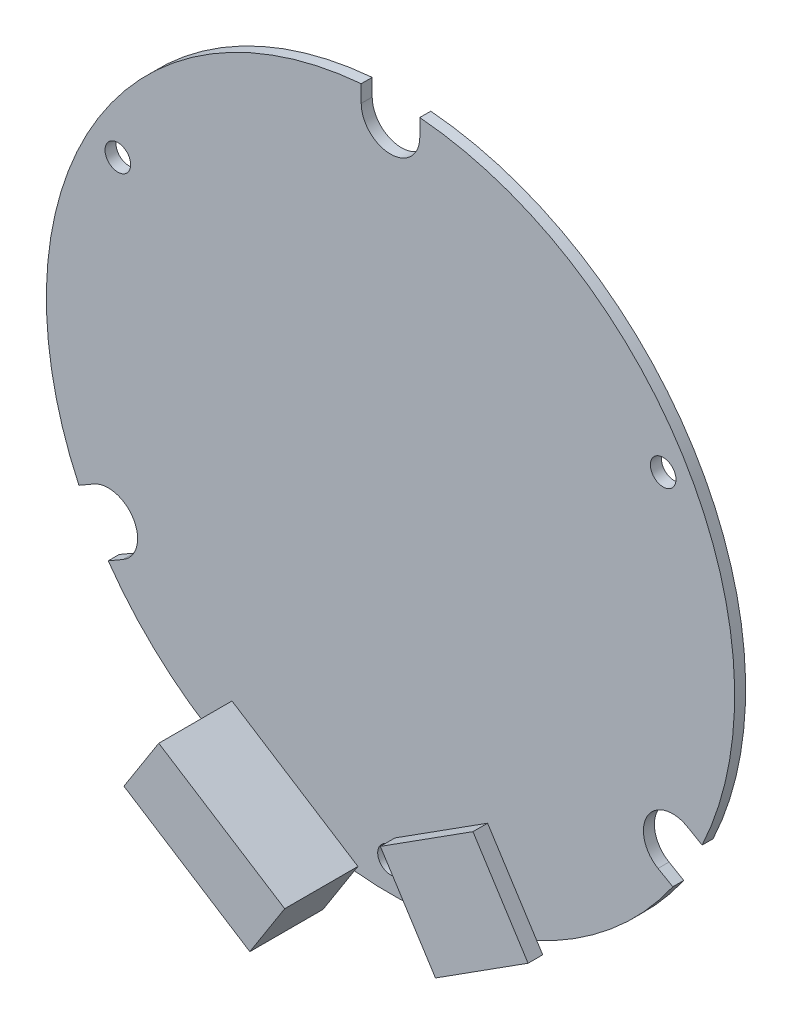
ISO-10303-21;
HEADER;
FILE_DESCRIPTION(('STEP AP214'),'2;1');
FILE_NAME('part.step','',(''),(''),'','','');
FILE_SCHEMA(('AUTOMOTIVE_DESIGN { 1 0 10303 214 1 1 1 1 }'));
ENDSEC;
DATA;
#1=APPLICATION_CONTEXT('core data for automotive mechanical design processes');
#2=APPLICATION_PROTOCOL_DEFINITION('international standard','automotive_design',2000,#1);
#3=PRODUCT_CONTEXT('',#1,'mechanical');
#4=PRODUCT('Part','Part','',(#3));
#5=PRODUCT_RELATED_PRODUCT_CATEGORY('part','',(#4));
#6=PRODUCT_DEFINITION_FORMATION('','',#4);
#7=PRODUCT_DEFINITION_CONTEXT('part definition',#1,'design');
#8=PRODUCT_DEFINITION('design','',#6,#7);
#9=PRODUCT_DEFINITION_SHAPE('','',#8);
#10=(LENGTH_UNIT() NAMED_UNIT(*) SI_UNIT(.MILLI.,.METRE.));
#11=(NAMED_UNIT(*) PLANE_ANGLE_UNIT() SI_UNIT($,.RADIAN.));
#12=(NAMED_UNIT(*) SI_UNIT($,.STERADIAN.) SOLID_ANGLE_UNIT());
#13=UNCERTAINTY_MEASURE_WITH_UNIT(LENGTH_MEASURE(1.E-05),#10,'distance_accuracy_value','');
#14=(GEOMETRIC_REPRESENTATION_CONTEXT(3) GLOBAL_UNCERTAINTY_ASSIGNED_CONTEXT((#13)) GLOBAL_UNIT_ASSIGNED_CONTEXT((#10,
#11,#12)) REPRESENTATION_CONTEXT('',''));
#15=CARTESIAN_POINT('',(0.,0.,0.));
#16=DIRECTION('',(0.,0.,1.));
#17=DIRECTION('',(1.,0.,0.));
#18=AXIS2_PLACEMENT_3D('',#15,#16,#17);
#19=CARTESIAN_POINT('',(15.259137072166,-30.0051714938875,5.5));
#20=DIRECTION('',(0.537741133403152,-0.843110000798409,0.));
#21=DIRECTION('',(0.843110000798409,0.537741133403152,0.));
#22=AXIS2_PLACEMENT_3D('',#19,#20,#21);
#23=PLANE('',#22);
#24=DIRECTION('',(-0.843110000798409,-0.537741133403152,0.));
#25=VECTOR('',#24,1.);
#26=CARTESIAN_POINT('',(15.259137072166,-30.0051714938875,3.5));
#27=LINE('',#26,#25);
#28=CARTESIAN_POINT('',(15.259137072166,-30.0051714938875,3.5));
#29=VERTEX_POINT('',#28);
#30=CARTESIAN_POINT('',(2.61248706018986,-38.0712884949348,3.5));
#31=VERTEX_POINT('',#30);
#32=EDGE_CURVE('E117',#29,#31,#27,.T.);
#33=ORIENTED_EDGE('',*,*,#32,.T.);
#34=DIRECTION('',(0.,0.,-1.));
#35=VECTOR('',#34,1.);
#36=CARTESIAN_POINT('',(2.61248706018986,-38.0712884949348,5.5));
#37=LINE('',#36,#35);
#38=CARTESIAN_POINT('',(2.61248706018986,-38.0712884949348,5.5));
#39=VERTEX_POINT('',#38);
#40=EDGE_CURVE('E12',#39,#31,#37,.T.);
#41=ORIENTED_EDGE('',*,*,#40,.F.);
#42=DIRECTION('',(-0.843110000798409,-0.537741133403152,0.));
#43=VECTOR('',#42,1.);
#44=CARTESIAN_POINT('',(15.259137072166,-30.0051714938875,5.5));
#45=LINE('',#44,#43);
#46=CARTESIAN_POINT('',(15.259137072166,-30.0051714938875,5.5));
#47=VERTEX_POINT('',#46);
#48=EDGE_CURVE('E105',#47,#39,#45,.T.);
#49=ORIENTED_EDGE('',*,*,#48,.F.);
#50=DIRECTION('',(0.,0.,-1.));
#51=VECTOR('',#50,1.);
#52=CARTESIAN_POINT('',(15.259137072166,-30.0051714938875,5.5));
#53=LINE('',#52,#51);
#54=EDGE_CURVE('E113',#47,#29,#53,.T.);
#55=ORIENTED_EDGE('',*,*,#54,.T.);
#56=EDGE_LOOP('',(#33,#41,#49,#55));
#57=FACE_BOUND('',#56,.T.);
#58=ADVANCED_FACE('F54',(#57),#23,.F.);
#59=CARTESIAN_POINT('',(2.61248706018986,-38.0712884949348,5.5));
#60=DIRECTION('',(0.84311000079841,0.537741133403152,0.));
#61=DIRECTION('',(-0.537741133403152,0.84311000079841,0.));
#62=AXIS2_PLACEMENT_3D('',#59,#60,#61);
#63=PLANE('',#62);
#64=DIRECTION('',(0.537741133403151,-0.843110000798409,0.));
#65=VECTOR('',#64,1.);
#66=CARTESIAN_POINT('',(2.61248706018986,-38.0712884949348,3.5));
#67=LINE('',#66,#65);
#68=CARTESIAN_POINT('',(10.140862927834,-49.8748285061125,3.5));
#69=VERTEX_POINT('',#68);
#70=EDGE_CURVE('E109',#31,#69,#67,.T.);
#71=ORIENTED_EDGE('',*,*,#70,.T.);
#72=DIRECTION('',(0.,0.,-1.));
#73=VECTOR('',#72,1.);
#74=CARTESIAN_POINT('',(10.140862927834,-49.8748285061125,5.5));
#75=LINE('',#74,#73);
#76=CARTESIAN_POINT('',(10.140862927834,-49.8748285061125,5.5));
#77=VERTEX_POINT('',#76);
#78=EDGE_CURVE('E62',#77,#69,#75,.T.);
#79=ORIENTED_EDGE('',*,*,#78,.F.);
#80=DIRECTION('',(0.537741133403151,-0.843110000798409,0.));
#81=VECTOR('',#80,1.);
#82=CARTESIAN_POINT('',(2.61248706018986,-38.0712884949348,5.5));
#83=LINE('',#82,#81);
#84=EDGE_CURVE('E100',#39,#77,#83,.T.);
#85=ORIENTED_EDGE('',*,*,#84,.F.);
#86=ORIENTED_EDGE('',*,*,#40,.T.);
#87=EDGE_LOOP('',(#71,#79,#85,#86));
#88=FACE_BOUND('',#87,.T.);
#89=ADVANCED_FACE('F108',(#88),#63,.F.);
#90=CARTESIAN_POINT('',(22.7875129398101,-41.8087115050652,5.5));
#91=DIRECTION('',(-0.537741133403152,0.843110000798409,0.));
#92=DIRECTION('',(-0.843110000798409,-0.537741133403152,0.));
#93=AXIS2_PLACEMENT_3D('',#90,#91,#92);
#94=PLANE('',#93);
#95=DIRECTION('',(0.843110000798409,0.537741133403152,0.));
#96=VECTOR('',#95,1.);
#97=CARTESIAN_POINT('',(22.7875129398101,-41.8087115050652,3.5));
#98=LINE('',#97,#96);
#99=CARTESIAN_POINT('',(22.7875129398101,-41.8087115050652,3.5));
#100=VERTEX_POINT('',#99);
#101=EDGE_CURVE('E87',#69,#100,#98,.T.);
#102=ORIENTED_EDGE('',*,*,#101,.T.);
#103=DIRECTION('',(0.,0.,-1.));
#104=VECTOR('',#103,1.);
#105=CARTESIAN_POINT('',(22.7875129398101,-41.8087115050652,5.5));
#106=LINE('',#105,#104);
#107=CARTESIAN_POINT('',(22.7875129398101,-41.8087115050652,5.5));
#108=VERTEX_POINT('',#107);
#109=EDGE_CURVE('E110',#108,#100,#106,.T.);
#110=ORIENTED_EDGE('',*,*,#109,.F.);
#111=DIRECTION('',(0.843110000798409,0.537741133403152,0.));
#112=VECTOR('',#111,1.);
#113=CARTESIAN_POINT('',(22.7875129398101,-41.8087115050652,5.5));
#114=LINE('',#113,#112);
#115=EDGE_CURVE('E103',#77,#108,#114,.T.);
#116=ORIENTED_EDGE('',*,*,#115,.F.);
#117=ORIENTED_EDGE('',*,*,#78,.T.);
#118=EDGE_LOOP('',(#102,#110,#116,#117));
#119=FACE_BOUND('',#118,.T.);
#120=ADVANCED_FACE('F111',(#119),#94,.F.);
#121=CARTESIAN_POINT('',(15.259137072166,-30.0051714938875,5.5));
#122=DIRECTION('',(-0.843110000798409,-0.537741133403152,0.));
#123=DIRECTION('',(0.537741133403152,-0.843110000798409,0.));
#124=AXIS2_PLACEMENT_3D('',#121,#122,#123);
#125=PLANE('',#124);
#126=DIRECTION('',(-0.537741133403152,0.843110000798409,0.));
#127=VECTOR('',#126,1.);
#128=CARTESIAN_POINT('',(15.259137072166,-30.0051714938875,3.5));
#129=LINE('',#128,#127);
#130=EDGE_CURVE('E93',#100,#29,#129,.T.);
#131=ORIENTED_EDGE('',*,*,#130,.T.);
#132=ORIENTED_EDGE('',*,*,#54,.F.);
#133=DIRECTION('',(-0.537741133403152,0.843110000798409,0.));
#134=VECTOR('',#133,1.);
#135=CARTESIAN_POINT('',(15.259137072166,-30.0051714938875,5.5));
#136=LINE('',#135,#134);
#137=EDGE_CURVE('E70',#108,#47,#136,.T.);
#138=ORIENTED_EDGE('',*,*,#137,.F.);
#139=ORIENTED_EDGE('',*,*,#109,.T.);
#140=EDGE_LOOP('',(#131,#132,#138,#139));
#141=FACE_BOUND('',#140,.T.);
#142=ADVANCED_FACE('F124',(#141),#125,.F.);
#143=CARTESIAN_POINT('',(0.,0.,5.5));
#144=DIRECTION('',(0.,0.,1.));
#145=DIRECTION('',(1.,0.,0.));
#146=AXIS2_PLACEMENT_3D('',#143,#144,#145);
#147=PLANE('',#146);
#148=ORIENTED_EDGE('',*,*,#48,.T.);
#149=ORIENTED_EDGE('',*,*,#84,.T.);
#150=ORIENTED_EDGE('',*,*,#115,.T.);
#151=ORIENTED_EDGE('',*,*,#137,.T.);
#152=EDGE_LOOP('',(#148,#149,#150,#151));
#153=FACE_BOUND('',#152,.T.);
#154=ADVANCED_FACE('F101',(#153),#147,.T.);
#155=CARTESIAN_POINT('',(0.,0.,3.5));
#156=DIRECTION('',(0.,0.,1.));
#157=DIRECTION('',(1.,0.,0.));
#158=AXIS2_PLACEMENT_3D('',#155,#156,#157);
#159=PLANE('',#158);
#160=ORIENTED_EDGE('',*,*,#32,.F.);
#161=ORIENTED_EDGE('',*,*,#130,.F.);
#162=ORIENTED_EDGE('',*,*,#101,.F.);
#163=ORIENTED_EDGE('',*,*,#70,.F.);
#164=EDGE_LOOP('',(#160,#161,#162,#163));
#165=FACE_BOUND('',#164,.T.);
#166=ADVANCED_FACE('F127',(#165),#159,.F.);
#167=CLOSED_SHELL('',(#58,#89,#120,#142,#154,#166));
#168=MANIFOLD_SOLID_BREP('B2',#167);
#169=CARTESIAN_POINT('',(0.,44.5,1.5));
#170=DIRECTION('',(0.,0.,-1.));
#171=DIRECTION('',(-1.,0.,0.));
#172=AXIS2_PLACEMENT_3D('',#169,#170,#171);
#173=CYLINDRICAL_SURFACE('',#172,4.);
#174=CARTESIAN_POINT('',(0.,44.5,0.));
#175=DIRECTION('',(0.,0.,1.));
#176=DIRECTION('',(1.,0.,0.));
#177=AXIS2_PLACEMENT_3D('',#174,#175,#176);
#178=CIRCLE('',#177,4.);
#179=CARTESIAN_POINT('',(-4.,44.5,0.));
#180=VERTEX_POINT('',#179);
#181=CARTESIAN_POINT('',(4.,44.5,0.));
#182=VERTEX_POINT('',#181);
#183=EDGE_CURVE('E342',#180,#182,#178,.T.);
#184=ORIENTED_EDGE('',*,*,#183,.F.);
#185=DIRECTION('',(0.,0.,-1.));
#186=VECTOR('',#185,1.);
#187=CARTESIAN_POINT('',(-4.,44.5,1.5));
#188=LINE('',#187,#186);
#189=CARTESIAN_POINT('',(-4.,44.5,1.5));
#190=VERTEX_POINT('',#189);
#191=EDGE_CURVE('E183',#190,#180,#188,.T.);
#192=ORIENTED_EDGE('',*,*,#191,.F.);
#193=CARTESIAN_POINT('',(0.,44.5,1.5));
#194=DIRECTION('',(0.,0.,1.));
#195=DIRECTION('',(1.,0.,0.));
#196=AXIS2_PLACEMENT_3D('',#193,#194,#195);
#197=CIRCLE('',#196,4.);
#198=CARTESIAN_POINT('',(4.,44.5,1.5));
#199=VERTEX_POINT('',#198);
#200=EDGE_CURVE('E363',#190,#199,#197,.T.);
#201=ORIENTED_EDGE('',*,*,#200,.T.);
#202=DIRECTION('',(0.,0.,-1.));
#203=VECTOR('',#202,1.);
#204=CARTESIAN_POINT('',(4.,44.5,1.5));
#205=LINE('',#204,#203);
#206=EDGE_CURVE('E425',#199,#182,#205,.T.);
#207=ORIENTED_EDGE('',*,*,#206,.T.);
#208=EDGE_LOOP('',(#184,#192,#201,#207));
#209=FACE_BOUND('',#208,.T.);
#210=ADVANCED_FACE('F180',(#209),#173,.F.);
#211=CARTESIAN_POINT('',(-4.,0.,1.5));
#212=DIRECTION('',(-1.,0.,0.));
#213=DIRECTION('',(0.,0.,1.));
#214=AXIS2_PLACEMENT_3D('',#211,#212,#213);
#215=PLANE('',#214);
#216=DIRECTION('',(0.,1.,0.));
#217=VECTOR('',#216,1.);
#218=CARTESIAN_POINT('',(-4.,0.,0.));
#219=LINE('',#218,#217);
#220=CARTESIAN_POINT('',(-4.,46.8294778958724,0.));
#221=VERTEX_POINT('',#220);
#222=EDGE_CURVE('E429',#180,#221,#219,.T.);
#223=ORIENTED_EDGE('',*,*,#222,.T.);
#224=DIRECTION('',(0.,0.,-1.));
#225=VECTOR('',#224,1.);
#226=CARTESIAN_POINT('',(-4.,46.8294778958724,1.5));
#227=LINE('',#226,#225);
#228=CARTESIAN_POINT('',(-4.,46.8294778958724,1.5));
#229=VERTEX_POINT('',#228);
#230=EDGE_CURVE('E499',#229,#221,#227,.T.);
#231=ORIENTED_EDGE('',*,*,#230,.F.);
#232=DIRECTION('',(0.,1.,0.));
#233=VECTOR('',#232,1.);
#234=CARTESIAN_POINT('',(-4.,0.,1.5));
#235=LINE('',#234,#233);
#236=EDGE_CURVE('E368',#190,#229,#235,.T.);
#237=ORIENTED_EDGE('',*,*,#236,.F.);
#238=ORIENTED_EDGE('',*,*,#191,.T.);
#239=EDGE_LOOP('',(#223,#231,#237,#238));
#240=FACE_BOUND('',#239,.T.);
#241=ADVANCED_FACE('F510',(#240),#215,.F.);
#242=CARTESIAN_POINT('',(0.,0.,1.5));
#243=DIRECTION('',(0.,0.,-1.));
#244=DIRECTION('',(-1.,0.,0.));
#245=AXIS2_PLACEMENT_3D('',#242,#243,#244);
#246=CYLINDRICAL_SURFACE('',#245,47.);
#247=CARTESIAN_POINT('',(0.,0.,0.));
#248=DIRECTION('',(0.,0.,1.));
#249=DIRECTION('',(1.,0.,0.));
#250=AXIS2_PLACEMENT_3D('',#247,#248,#249);
#251=CIRCLE('',#250,47.);
#252=CARTESIAN_POINT('',(-42.5555175037918,-19.950637332789,0.));
#253=VERTEX_POINT('',#252);
#254=EDGE_CURVE('E432',#221,#253,#251,.T.);
#255=ORIENTED_EDGE('',*,*,#254,.T.);
#256=DIRECTION('',(0.,0.,-1.));
#257=VECTOR('',#256,1.);
#258=CARTESIAN_POINT('',(-42.5555175037918,-19.950637332789,1.5));
#259=LINE('',#258,#257);
#260=CARTESIAN_POINT('',(-42.5555175037918,-19.950637332789,1.5));
#261=VERTEX_POINT('',#260);
#262=EDGE_CURVE('E497',#261,#253,#259,.T.);
#263=ORIENTED_EDGE('',*,*,#262,.F.);
#264=CARTESIAN_POINT('',(0.,0.,1.5));
#265=DIRECTION('',(0.,0.,1.));
#266=DIRECTION('',(1.,0.,0.));
#267=AXIS2_PLACEMENT_3D('',#264,#265,#266);
#268=CIRCLE('',#267,47.);
#269=EDGE_CURVE('E377',#229,#261,#268,.T.);
#270=ORIENTED_EDGE('',*,*,#269,.F.);
#271=ORIENTED_EDGE('',*,*,#230,.T.);
#272=EDGE_LOOP('',(#255,#263,#270,#271));
#273=FACE_BOUND('',#272,.T.);
#274=ADVANCED_FACE('F557',(#273),#246,.T.);
#275=CARTESIAN_POINT('',(-1.99999999999923,3.4641016151382,1.5));
#276=DIRECTION('',(0.499999999999807,-0.86602540378455,0.));
#277=DIRECTION('',(0.86602540378455,0.499999999999807,0.));
#278=AXIS2_PLACEMENT_3D('',#275,#276,#277);
#279=PLANE('',#278);
#280=DIRECTION('',(-0.86602540378455,-0.499999999999807,0.));
#281=VECTOR('',#280,1.);
#282=CARTESIAN_POINT('',(-1.99999999999923,3.4641016151382,0.));
#283=LINE('',#282,#281);
#284=CARTESIAN_POINT('',(-40.5381304684117,-18.7858983848532,0.));
#285=VERTEX_POINT('',#284);
#286=EDGE_CURVE('E436',#285,#253,#283,.T.);
#287=ORIENTED_EDGE('',*,*,#286,.F.);
#288=DIRECTION('',(0.,0.,-1.));
#289=VECTOR('',#288,1.);
#290=CARTESIAN_POINT('',(-40.5381304684117,-18.7858983848532,1.5));
#291=LINE('',#290,#289);
#292=CARTESIAN_POINT('',(-40.5381304684117,-18.7858983848532,1.5));
#293=VERTEX_POINT('',#292);
#294=EDGE_CURVE('E494',#293,#285,#291,.T.);
#295=ORIENTED_EDGE('',*,*,#294,.F.);
#296=DIRECTION('',(-0.86602540378455,-0.499999999999807,0.));
#297=VECTOR('',#296,1.);
#298=CARTESIAN_POINT('',(-1.99999999999923,3.4641016151382,1.5));
#299=LINE('',#298,#297);
#300=EDGE_CURVE('E380',#293,#261,#299,.T.);
#301=ORIENTED_EDGE('',*,*,#300,.T.);
#302=ORIENTED_EDGE('',*,*,#262,.T.);
#303=EDGE_LOOP('',(#287,#295,#301,#302));
#304=FACE_BOUND('',#303,.T.);
#305=ADVANCED_FACE('F555',(#304),#279,.T.);
#306=CARTESIAN_POINT('',(-38.5381304684125,-22.2499999999914,1.5));
#307=DIRECTION('',(0.,0.,-1.));
#308=DIRECTION('',(-1.,0.,0.));
#309=AXIS2_PLACEMENT_3D('',#306,#307,#308);
#310=CYLINDRICAL_SURFACE('',#309,4.);
#311=CARTESIAN_POINT('',(-38.5381304684125,-22.2499999999914,0.));
#312=DIRECTION('',(0.,0.,1.));
#313=DIRECTION('',(1.,0.,0.));
#314=AXIS2_PLACEMENT_3D('',#311,#312,#313);
#315=CIRCLE('',#314,4.);
#316=CARTESIAN_POINT('',(-36.5381304684132,-25.7141016151296,0.));
#317=VERTEX_POINT('',#316);
#318=EDGE_CURVE('E440',#317,#285,#315,.T.);
#319=ORIENTED_EDGE('',*,*,#318,.F.);
#320=DIRECTION('',(0.,0.,-1.));
#321=VECTOR('',#320,1.);
#322=CARTESIAN_POINT('',(-36.5381304684132,-25.7141016151296,1.5));
#323=LINE('',#322,#321);
#324=CARTESIAN_POINT('',(-36.5381304684132,-25.7141016151296,1.5));
#325=VERTEX_POINT('',#324);
#326=EDGE_CURVE('E491',#325,#317,#323,.T.);
#327=ORIENTED_EDGE('',*,*,#326,.F.);
#328=CARTESIAN_POINT('',(-38.5381304684125,-22.2499999999914,1.5));
#329=DIRECTION('',(0.,0.,1.));
#330=DIRECTION('',(1.,0.,0.));
#331=AXIS2_PLACEMENT_3D('',#328,#329,#330);
#332=CIRCLE('',#331,4.);
#333=EDGE_CURVE('E385',#325,#293,#332,.T.);
#334=ORIENTED_EDGE('',*,*,#333,.T.);
#335=ORIENTED_EDGE('',*,*,#294,.T.);
#336=EDGE_LOOP('',(#319,#327,#334,#335));
#337=FACE_BOUND('',#336,.T.);
#338=ADVANCED_FACE('F551',(#337),#310,.F.);
#339=CARTESIAN_POINT('',(1.99999999999926,-3.46410161513827,1.5));
#340=DIRECTION('',(0.499999999999806,-0.866025403784551,0.));
#341=DIRECTION('',(0.866025403784551,0.499999999999806,0.));
#342=AXIS2_PLACEMENT_3D('',#339,#340,#341);
#343=PLANE('',#342);
#344=DIRECTION('',(-0.866025403784551,-0.499999999999806,0.));
#345=VECTOR('',#344,1.);
#346=CARTESIAN_POINT('',(1.99999999999926,-3.46410161513827,0.));
#347=LINE('',#346,#345);
#348=CARTESIAN_POINT('',(-38.5555175037933,-26.8788405630654,0.));
#349=VERTEX_POINT('',#348);
#350=EDGE_CURVE('E444',#317,#349,#347,.T.);
#351=ORIENTED_EDGE('',*,*,#350,.T.);
#352=DIRECTION('',(0.,0.,-1.));
#353=VECTOR('',#352,1.);
#354=CARTESIAN_POINT('',(-38.5555175037933,-26.8788405630654,1.5));
#355=LINE('',#354,#353);
#356=CARTESIAN_POINT('',(-38.5555175037933,-26.8788405630654,1.5));
#357=VERTEX_POINT('',#356);
#358=EDGE_CURVE('E487',#357,#349,#355,.T.);
#359=ORIENTED_EDGE('',*,*,#358,.F.);
#360=DIRECTION('',(-0.866025403784551,-0.499999999999806,0.));
#361=VECTOR('',#360,1.);
#362=CARTESIAN_POINT('',(1.99999999999926,-3.46410161513827,1.5));
#363=LINE('',#362,#361);
#364=EDGE_CURVE('E390',#325,#357,#363,.T.);
#365=ORIENTED_EDGE('',*,*,#364,.F.);
#366=ORIENTED_EDGE('',*,*,#326,.T.);
#367=EDGE_LOOP('',(#351,#359,#365,#366));
#368=FACE_BOUND('',#367,.T.);
#369=ADVANCED_FACE('F547',(#368),#343,.F.);
#370=CARTESIAN_POINT('',(0.,0.,1.5));
#371=DIRECTION('',(0.,0.,-1.));
#372=DIRECTION('',(-1.,0.,0.));
#373=AXIS2_PLACEMENT_3D('',#370,#371,#372);
#374=CYLINDRICAL_SURFACE('',#373,47.);
#375=CARTESIAN_POINT('',(0.,0.,0.));
#376=DIRECTION('',(0.,0.,1.));
#377=DIRECTION('',(1.,0.,0.));
#378=AXIS2_PLACEMENT_3D('',#375,#376,#377);
#379=CIRCLE('',#378,47.);
#380=CARTESIAN_POINT('',(38.5555175037843,-26.8788405630782,0.));
#381=VERTEX_POINT('',#380);
#382=EDGE_CURVE('E447',#349,#381,#379,.T.);
#383=ORIENTED_EDGE('',*,*,#382,.T.);
#384=DIRECTION('',(0.,0.,-1.));
#385=VECTOR('',#384,1.);
#386=CARTESIAN_POINT('',(38.5555175037843,-26.8788405630782,1.5));
#387=LINE('',#386,#385);
#388=CARTESIAN_POINT('',(38.5555175037843,-26.8788405630782,1.5));
#389=VERTEX_POINT('',#388);
#390=EDGE_CURVE('E484',#389,#381,#387,.T.);
#391=ORIENTED_EDGE('',*,*,#390,.F.);
#392=CARTESIAN_POINT('',(0.,0.,1.5));
#393=DIRECTION('',(0.,0.,1.));
#394=DIRECTION('',(1.,0.,0.));
#395=AXIS2_PLACEMENT_3D('',#392,#393,#394);
#396=CIRCLE('',#395,47.);
#397=CARTESIAN_POINT('',(-4.93878494091711,-46.7397946434018,1.5));
#398=VERTEX_POINT('',#397);
#399=EDGE_CURVE('E403',#398,#389,#396,.T.);
#400=ORIENTED_EDGE('',*,*,#399,.F.);
#401=CARTESIAN_POINT('',(-24.791719058283,-39.9295713242099,1.5));
#402=VERTEX_POINT('',#401);
#403=EDGE_CURVE('E402',#402,#398,#396,.T.);
#404=ORIENTED_EDGE('',*,*,#403,.F.);
#405=EDGE_CURVE('E398',#357,#402,#396,.T.);
#406=ORIENTED_EDGE('',*,*,#405,.F.);
#407=ORIENTED_EDGE('',*,*,#358,.T.);
#408=EDGE_LOOP('',(#383,#391,#400,#404,#406,#407));
#409=FACE_BOUND('',#408,.T.);
#410=ADVANCED_FACE('F542',(#409),#374,.T.);
#411=CARTESIAN_POINT('',(-2.00000000000036,-3.46410161513748,1.5));
#412=DIRECTION('',(0.500000000000097,0.866025403784382,0.));
#413=DIRECTION('',(-0.866025403784382,0.500000000000098,0.));
#414=AXIS2_PLACEMENT_3D('',#411,#412,#413);
#415=PLANE('',#414);
#416=DIRECTION('',(0.866025403784382,-0.500000000000098,0.));
#417=VECTOR('',#416,1.);
#418=CARTESIAN_POINT('',(-2.00000000000036,-3.46410161513748,0.));
#419=LINE('',#418,#417);
#420=CARTESIAN_POINT('',(36.5381304684047,-25.7141016151418,0.));
#421=VERTEX_POINT('',#420);
#422=EDGE_CURVE('E451',#421,#381,#419,.T.);
#423=ORIENTED_EDGE('',*,*,#422,.F.);
#424=DIRECTION('',(0.,0.,-1.));
#425=VECTOR('',#424,1.);
#426=CARTESIAN_POINT('',(36.5381304684047,-25.7141016151418,1.5));
#427=LINE('',#426,#425);
#428=CARTESIAN_POINT('',(36.5381304684047,-25.7141016151418,1.5));
#429=VERTEX_POINT('',#428);
#430=EDGE_CURVE('E481',#429,#421,#427,.T.);
#431=ORIENTED_EDGE('',*,*,#430,.F.);
#432=DIRECTION('',(0.866025403784382,-0.500000000000098,0.));
#433=VECTOR('',#432,1.);
#434=CARTESIAN_POINT('',(-2.00000000000036,-3.46410161513748,1.5));
#435=LINE('',#434,#433);
#436=EDGE_CURVE('E401',#429,#389,#435,.T.);
#437=ORIENTED_EDGE('',*,*,#436,.T.);
#438=ORIENTED_EDGE('',*,*,#390,.T.);
#439=EDGE_LOOP('',(#423,#431,#437,#438));
#440=FACE_BOUND('',#439,.T.);
#441=ADVANCED_FACE('F538',(#440),#415,.T.);
#442=CARTESIAN_POINT('',(38.5381304684051,-22.2500000000043,1.5));
#443=DIRECTION('',(0.,0.,-1.));
#444=DIRECTION('',(-1.,0.,0.));
#445=AXIS2_PLACEMENT_3D('',#442,#443,#444);
#446=CYLINDRICAL_SURFACE('',#445,4.);
#447=CARTESIAN_POINT('',(38.5381304684051,-22.2500000000043,0.));
#448=DIRECTION('',(0.,0.,1.));
#449=DIRECTION('',(1.,0.,0.));
#450=AXIS2_PLACEMENT_3D('',#447,#448,#449);
#451=CIRCLE('',#450,4.);
#452=CARTESIAN_POINT('',(40.5381304684054,-18.7858983848668,0.));
#453=VERTEX_POINT('',#452);
#454=EDGE_CURVE('E455',#453,#421,#451,.T.);
#455=ORIENTED_EDGE('',*,*,#454,.F.);
#456=DIRECTION('',(0.,0.,-1.));
#457=VECTOR('',#456,1.);
#458=CARTESIAN_POINT('',(40.5381304684054,-18.7858983848668,1.5));
#459=LINE('',#458,#457);
#460=CARTESIAN_POINT('',(40.5381304684054,-18.7858983848668,1.5));
#461=VERTEX_POINT('',#460);
#462=EDGE_CURVE('E478',#461,#453,#459,.T.);
#463=ORIENTED_EDGE('',*,*,#462,.F.);
#464=CARTESIAN_POINT('',(38.5381304684051,-22.2500000000043,1.5));
#465=DIRECTION('',(0.,0.,1.));
#466=DIRECTION('',(1.,0.,0.));
#467=AXIS2_PLACEMENT_3D('',#464,#465,#466);
#468=CIRCLE('',#467,4.);
#469=EDGE_CURVE('E408',#461,#429,#468,.T.);
#470=ORIENTED_EDGE('',*,*,#469,.T.);
#471=ORIENTED_EDGE('',*,*,#430,.T.);
#472=EDGE_LOOP('',(#455,#463,#470,#471));
#473=FACE_BOUND('',#472,.T.);
#474=ADVANCED_FACE('F533',(#473),#446,.F.);
#475=CARTESIAN_POINT('',(2.00000000000036,3.46410161513749,1.5));
#476=DIRECTION('',(0.500000000000095,0.866025403784384,0.));
#477=DIRECTION('',(-0.866025403784384,0.500000000000095,0.));
#478=AXIS2_PLACEMENT_3D('',#475,#476,#477);
#479=PLANE('',#478);
#480=DIRECTION('',(0.866025403784384,-0.500000000000095,0.));
#481=VECTOR('',#480,1.);
#482=CARTESIAN_POINT('',(2.00000000000036,3.46410161513749,0.));
#483=LINE('',#482,#481);
#484=CARTESIAN_POINT('',(42.5555175037851,-19.9506373328032,0.));
#485=VERTEX_POINT('',#484);
#486=EDGE_CURVE('E459',#453,#485,#483,.T.);
#487=ORIENTED_EDGE('',*,*,#486,.T.);
#488=DIRECTION('',(0.,0.,-1.));
#489=VECTOR('',#488,1.);
#490=CARTESIAN_POINT('',(42.5555175037851,-19.9506373328032,1.5));
#491=LINE('',#490,#489);
#492=CARTESIAN_POINT('',(42.5555175037851,-19.9506373328032,1.5));
#493=VERTEX_POINT('',#492);
#494=EDGE_CURVE('E474',#493,#485,#491,.T.);
#495=ORIENTED_EDGE('',*,*,#494,.F.);
#496=DIRECTION('',(0.866025403784384,-0.500000000000095,0.));
#497=VECTOR('',#496,1.);
#498=CARTESIAN_POINT('',(2.00000000000036,3.46410161513749,1.5));
#499=LINE('',#498,#497);
#500=EDGE_CURVE('E413',#461,#493,#499,.T.);
#501=ORIENTED_EDGE('',*,*,#500,.F.);
#502=ORIENTED_EDGE('',*,*,#462,.T.);
#503=EDGE_LOOP('',(#487,#495,#501,#502));
#504=FACE_BOUND('',#503,.T.);
#505=ADVANCED_FACE('F530',(#504),#479,.F.);
#506=CARTESIAN_POINT('',(0.,0.,1.5));
#507=DIRECTION('',(0.,0.,-1.));
#508=DIRECTION('',(-1.,0.,0.));
#509=AXIS2_PLACEMENT_3D('',#506,#507,#508);
#510=CYLINDRICAL_SURFACE('',#509,47.);
#511=CARTESIAN_POINT('',(0.,0.,0.));
#512=DIRECTION('',(0.,0.,1.));
#513=DIRECTION('',(1.,0.,0.));
#514=AXIS2_PLACEMENT_3D('',#511,#512,#513);
#515=CIRCLE('',#514,47.);
#516=CARTESIAN_POINT('',(4.,46.8294778958724,0.));
#517=VERTEX_POINT('',#516);
#518=EDGE_CURVE('E462',#485,#517,#515,.T.);
#519=ORIENTED_EDGE('',*,*,#518,.T.);
#520=DIRECTION('',(0.,0.,-1.));
#521=VECTOR('',#520,1.);
#522=CARTESIAN_POINT('',(4.,46.8294778958724,1.5));
#523=LINE('',#522,#521);
#524=CARTESIAN_POINT('',(4.,46.8294778958724,1.5));
#525=VERTEX_POINT('',#524);
#526=EDGE_CURVE('E471',#525,#517,#523,.T.);
#527=ORIENTED_EDGE('',*,*,#526,.F.);
#528=CARTESIAN_POINT('',(0.,0.,1.5));
#529=DIRECTION('',(0.,0.,1.));
#530=DIRECTION('',(1.,0.,0.));
#531=AXIS2_PLACEMENT_3D('',#528,#529,#530);
#532=CIRCLE('',#531,47.);
#533=EDGE_CURVE('E417',#493,#525,#532,.T.);
#534=ORIENTED_EDGE('',*,*,#533,.F.);
#535=ORIENTED_EDGE('',*,*,#494,.T.);
#536=EDGE_LOOP('',(#519,#527,#534,#535));
#537=FACE_BOUND('',#536,.T.);
#538=ADVANCED_FACE('F525',(#537),#510,.T.);
#539=CARTESIAN_POINT('',(4.,0.,1.5));
#540=DIRECTION('',(-1.,0.,0.));
#541=DIRECTION('',(0.,0.,1.));
#542=AXIS2_PLACEMENT_3D('',#539,#540,#541);
#543=PLANE('',#542);
#544=DIRECTION('',(0.,1.,0.));
#545=VECTOR('',#544,1.);
#546=CARTESIAN_POINT('',(4.,0.,0.));
#547=LINE('',#546,#545);
#548=EDGE_CURVE('E369',#182,#517,#547,.T.);
#549=ORIENTED_EDGE('',*,*,#548,.F.);
#550=ORIENTED_EDGE('',*,*,#206,.F.);
#551=DIRECTION('',(0.,1.,0.));
#552=VECTOR('',#551,1.);
#553=CARTESIAN_POINT('',(4.,0.,1.5));
#554=LINE('',#553,#552);
#555=EDGE_CURVE('E420',#199,#525,#554,.T.);
#556=ORIENTED_EDGE('',*,*,#555,.T.);
#557=ORIENTED_EDGE('',*,*,#526,.T.);
#558=EDGE_LOOP('',(#549,#550,#556,#557));
#559=FACE_BOUND('',#558,.T.);
#560=ADVANCED_FACE('F519',(#559),#543,.T.);
#561=CARTESIAN_POINT('',(0.,0.,1.5));
#562=DIRECTION('',(0.,0.,1.));
#563=DIRECTION('',(1.,0.,0.));
#564=AXIS2_PLACEMENT_3D('',#561,#562,#563);
#565=PLANE('',#564);
#566=DIRECTION('',(-0.537799992274543,-0.843072457330627,0.));
#567=VECTOR('',#566,1.);
#568=CARTESIAN_POINT('',(-26.4091040305872,-42.4650357024877,1.5));
#569=LINE('',#568,#567);
#570=CARTESIAN_POINT('',(-21.6495740989575,-35.0038444551116,1.5));
#571=VERTEX_POINT('',#570);
#572=EDGE_CURVE('E197',#571,#402,#569,.T.);
#573=ORIENTED_EDGE('',*,*,#572,.F.);
#574=DIRECTION('',(-0.843072457330627,0.537799992274542,0.));
#575=VECTOR('',#574,1.);
#576=CARTESIAN_POINT('',(-21.6495740989575,-35.0038444551116,1.5));
#577=LINE('',#576,#575);
#578=CARTESIAN_POINT('',(-4.45089596941274,-45.9749642975123,1.5));
#579=VERTEX_POINT('',#578);
#580=EDGE_CURVE('E320',#579,#571,#577,.T.);
#581=ORIENTED_EDGE('',*,*,#580,.F.);
#582=DIRECTION('',(0.537799992274543,0.843072457330627,0.));
#583=VECTOR('',#582,1.);
#584=CARTESIAN_POINT('',(-9.21042590104244,-53.4361555448884,1.5));
#585=LINE('',#584,#583);
#586=EDGE_CURVE('E52',#398,#579,#585,.T.);
#587=ORIENTED_EDGE('',*,*,#586,.F.);
#588=ORIENTED_EDGE('',*,*,#399,.T.);
#589=ORIENTED_EDGE('',*,*,#436,.F.);
#590=ORIENTED_EDGE('',*,*,#469,.F.);
#591=ORIENTED_EDGE('',*,*,#500,.T.);
#592=ORIENTED_EDGE('',*,*,#533,.T.);
#593=ORIENTED_EDGE('',*,*,#555,.F.);
#594=ORIENTED_EDGE('',*,*,#200,.F.);
#595=ORIENTED_EDGE('',*,*,#236,.T.);
#596=ORIENTED_EDGE('',*,*,#269,.T.);
#597=ORIENTED_EDGE('',*,*,#300,.F.);
#598=ORIENTED_EDGE('',*,*,#333,.F.);
#599=ORIENTED_EDGE('',*,*,#364,.T.);
#600=ORIENTED_EDGE('',*,*,#405,.T.);
#601=EDGE_LOOP('',(#573,#581,#587,#588,#589,#590,#591,#592,#593,#594,#595,#596,#597,#598,#599,#600));
#602=FACE_BOUND('',#601,.T.);
#603=CARTESIAN_POINT('',(-37.2390923627309,21.4999999999999,1.5));
#604=DIRECTION('',(0.,0.,1.));
#605=DIRECTION('',(1.,0.,0.));
#606=AXIS2_PLACEMENT_3D('',#603,#604,#605);
#607=CIRCLE('',#606,1.75000000000001);
#608=CARTESIAN_POINT('',(-35.4890923627309,21.4999999999999,1.5));
#609=VERTEX_POINT('',#608);
#610=EDGE_CURVE('E343',#609,#609,#607,.T.);
#611=ORIENTED_EDGE('',*,*,#610,.F.);
#612=EDGE_LOOP('',(#611));
#613=FACE_BOUND('',#612,.T.);
#614=CARTESIAN_POINT('',(37.2390923627332,21.499999999996,1.5));
#615=DIRECTION('',(0.,0.,1.));
#616=DIRECTION('',(1.,0.,0.));
#617=AXIS2_PLACEMENT_3D('',#614,#615,#616);
#618=CIRCLE('',#617,1.75000000000003);
#619=CARTESIAN_POINT('',(38.9890923627332,21.499999999996,1.5));
#620=VERTEX_POINT('',#619);
#621=EDGE_CURVE('E354',#620,#620,#618,.T.);
#622=ORIENTED_EDGE('',*,*,#621,.F.);
#623=EDGE_LOOP('',(#622));
#624=FACE_BOUND('',#623,.T.);
#625=CARTESIAN_POINT('',(-9.36924149375074E-12,-43.,1.5));
#626=DIRECTION('',(0.,0.,1.));
#627=DIRECTION('',(1.,0.,0.));
#628=AXIS2_PLACEMENT_3D('',#625,#626,#627);
#629=CIRCLE('',#628,1.75000000000001);
#630=CARTESIAN_POINT('',(1.74999999999064,-43.,1.5));
#631=VERTEX_POINT('',#630);
#632=EDGE_CURVE('E327',#631,#631,#629,.T.);
#633=ORIENTED_EDGE('',*,*,#632,.F.);
#634=EDGE_LOOP('',(#633));
#635=FACE_BOUND('',#634,.T.);
#636=ADVANCED_FACE('F641',(#602,#613,#624,#635),#565,.T.);
#637=CARTESIAN_POINT('',(0.,0.,0.));
#638=DIRECTION('',(0.,0.,1.));
#639=DIRECTION('',(1.,0.,0.));
#640=AXIS2_PLACEMENT_3D('',#637,#638,#639);
#641=PLANE('',#640);
#642=CARTESIAN_POINT('',(-37.2390923627309,21.4999999999999,0.));
#643=DIRECTION('',(0.,0.,1.));
#644=DIRECTION('',(1.,0.,0.));
#645=AXIS2_PLACEMENT_3D('',#642,#643,#644);
#646=CIRCLE('',#645,1.75000000000001);
#647=CARTESIAN_POINT('',(-35.4890923627309,21.4999999999999,0.));
#648=VERTEX_POINT('',#647);
#649=EDGE_CURVE('E338',#648,#648,#646,.T.);
#650=ORIENTED_EDGE('',*,*,#649,.T.);
#651=EDGE_LOOP('',(#650));
#652=FACE_BOUND('',#651,.T.);
#653=CARTESIAN_POINT('',(37.2390923627332,21.499999999996,0.));
#654=DIRECTION('',(0.,0.,1.));
#655=DIRECTION('',(1.,0.,0.));
#656=AXIS2_PLACEMENT_3D('',#653,#654,#655);
#657=CIRCLE('',#656,1.75000000000003);
#658=CARTESIAN_POINT('',(38.9890923627332,21.499999999996,0.));
#659=VERTEX_POINT('',#658);
#660=EDGE_CURVE('E348',#659,#659,#657,.T.);
#661=ORIENTED_EDGE('',*,*,#660,.T.);
#662=EDGE_LOOP('',(#661));
#663=FACE_BOUND('',#662,.T.);
#664=CARTESIAN_POINT('',(-9.36924149375074E-12,-43.,0.));
#665=DIRECTION('',(0.,0.,1.));
#666=DIRECTION('',(1.,0.,0.));
#667=AXIS2_PLACEMENT_3D('',#664,#665,#666);
#668=CIRCLE('',#667,1.75000000000001);
#669=CARTESIAN_POINT('',(1.74999999999064,-43.,0.));
#670=VERTEX_POINT('',#669);
#671=EDGE_CURVE('E332',#670,#670,#668,.T.);
#672=ORIENTED_EDGE('',*,*,#671,.T.);
#673=EDGE_LOOP('',(#672));
#674=FACE_BOUND('',#673,.T.);
#675=ORIENTED_EDGE('',*,*,#183,.T.);
#676=ORIENTED_EDGE('',*,*,#548,.T.);
#677=ORIENTED_EDGE('',*,*,#518,.F.);
#678=ORIENTED_EDGE('',*,*,#486,.F.);
#679=ORIENTED_EDGE('',*,*,#454,.T.);
#680=ORIENTED_EDGE('',*,*,#422,.T.);
#681=ORIENTED_EDGE('',*,*,#382,.F.);
#682=ORIENTED_EDGE('',*,*,#350,.F.);
#683=ORIENTED_EDGE('',*,*,#318,.T.);
#684=ORIENTED_EDGE('',*,*,#286,.T.);
#685=ORIENTED_EDGE('',*,*,#254,.F.);
#686=ORIENTED_EDGE('',*,*,#222,.F.);
#687=EDGE_LOOP('',(#675,#676,#677,#678,#679,#680,#681,#682,#683,#684,#685,#686));
#688=FACE_BOUND('',#687,.T.);
#689=ADVANCED_FACE('F515',(#652,#663,#674,#688),#641,.F.);
#690=CARTESIAN_POINT('',(-9.36924149375074E-12,-43.,0.));
#691=DIRECTION('',(0.,0.,1.));
#692=DIRECTION('',(1.,0.,0.));
#693=AXIS2_PLACEMENT_3D('',#690,#691,#692);
#694=CYLINDRICAL_SURFACE('',#693,1.75000000000001);
#695=ORIENTED_EDGE('',*,*,#671,.F.);
#696=EDGE_LOOP('',(#695));
#697=FACE_BOUND('',#696,.T.);
#698=ORIENTED_EDGE('',*,*,#632,.T.);
#699=EDGE_LOOP('',(#698));
#700=FACE_BOUND('',#699,.T.);
#701=ADVANCED_FACE('F652',(#697,#700),#694,.F.);
#702=CARTESIAN_POINT('',(37.2390923627332,21.499999999996,0.));
#703=DIRECTION('',(0.,0.,1.));
#704=DIRECTION('',(1.,0.,0.));
#705=AXIS2_PLACEMENT_3D('',#702,#703,#704);
#706=CYLINDRICAL_SURFACE('',#705,1.75000000000003);
#707=ORIENTED_EDGE('',*,*,#660,.F.);
#708=EDGE_LOOP('',(#707));
#709=FACE_BOUND('',#708,.T.);
#710=ORIENTED_EDGE('',*,*,#621,.T.);
#711=EDGE_LOOP('',(#710));
#712=FACE_BOUND('',#711,.T.);
#713=ADVANCED_FACE('F662',(#709,#712),#706,.F.);
#714=CARTESIAN_POINT('',(-37.2390923627309,21.4999999999999,0.));
#715=DIRECTION('',(0.,0.,1.));
#716=DIRECTION('',(1.,0.,0.));
#717=AXIS2_PLACEMENT_3D('',#714,#715,#716);
#718=CYLINDRICAL_SURFACE('',#717,1.75000000000001);
#719=ORIENTED_EDGE('',*,*,#649,.F.);
#720=EDGE_LOOP('',(#719));
#721=FACE_BOUND('',#720,.T.);
#722=ORIENTED_EDGE('',*,*,#610,.T.);
#723=EDGE_LOOP('',(#722));
#724=FACE_BOUND('',#723,.T.);
#725=ADVANCED_FACE('F672',(#721,#724),#718,.F.);
#726=CARTESIAN_POINT('',(-26.4091040305872,-42.4650357024877,11.5));
#727=DIRECTION('',(0.843072457330627,-0.537799992274543,0.));
#728=DIRECTION('',(0.537799992274543,0.843072457330627,0.));
#729=AXIS2_PLACEMENT_3D('',#726,#727,#728);
#730=PLANE('',#729);
#731=ORIENTED_EDGE('',*,*,#572,.T.);
#732=CARTESIAN_POINT('',(-26.4091040305872,-42.4650357024877,1.5));
#733=VERTEX_POINT('',#732);
#734=EDGE_CURVE('E324',#402,#733,#569,.T.);
#735=ORIENTED_EDGE('',*,*,#734,.T.);
#736=DIRECTION('',(0.,0.,-1.));
#737=VECTOR('',#736,1.);
#738=CARTESIAN_POINT('',(-26.4091040305872,-42.4650357024877,11.5));
#739=LINE('',#738,#737);
#740=CARTESIAN_POINT('',(-26.4091040305872,-42.4650357024877,11.5));
#741=VERTEX_POINT('',#740);
#742=EDGE_CURVE('E303',#741,#733,#739,.T.);
#743=ORIENTED_EDGE('',*,*,#742,.F.);
#744=DIRECTION('',(-0.537799992274543,-0.843072457330627,0.));
#745=VECTOR('',#744,1.);
#746=CARTESIAN_POINT('',(-26.4091040305872,-42.4650357024877,11.5));
#747=LINE('',#746,#745);
#748=CARTESIAN_POINT('',(-21.6495740989575,-35.0038444551116,11.5));
#749=VERTEX_POINT('',#748);
#750=EDGE_CURVE('E310',#749,#741,#747,.T.);
#751=ORIENTED_EDGE('',*,*,#750,.F.);
#752=DIRECTION('',(0.,0.,-1.));
#753=VECTOR('',#752,1.);
#754=CARTESIAN_POINT('',(-21.6495740989575,-35.0038444551116,11.5));
#755=LINE('',#754,#753);
#756=EDGE_CURVE('E754',#749,#571,#755,.T.);
#757=ORIENTED_EDGE('',*,*,#756,.T.);
#758=EDGE_LOOP('',(#731,#735,#743,#751,#757));
#759=FACE_BOUND('',#758,.T.);
#760=ADVANCED_FACE('F322',(#759),#730,.F.);
#761=CARTESIAN_POINT('',(-26.4091040305872,-42.4650357024877,11.5));
#762=DIRECTION('',(0.537799992274543,0.843072457330627,0.));
#763=DIRECTION('',(-0.843072457330627,0.537799992274543,0.));
#764=AXIS2_PLACEMENT_3D('',#761,#762,#763);
#765=PLANE('',#764);
#766=DIRECTION('',(0.843072457330627,-0.537799992274543,0.));
#767=VECTOR('',#766,1.);
#768=CARTESIAN_POINT('',(-26.4091040305872,-42.4650357024877,1.5));
#769=LINE('',#768,#767);
#770=CARTESIAN_POINT('',(-9.21042590104244,-53.4361555448884,1.5));
#771=VERTEX_POINT('',#770);
#772=EDGE_CURVE('E751',#733,#771,#769,.T.);
#773=ORIENTED_EDGE('',*,*,#772,.T.);
#774=DIRECTION('',(0.,0.,-1.));
#775=VECTOR('',#774,1.);
#776=CARTESIAN_POINT('',(-9.21042590104244,-53.4361555448884,11.5));
#777=LINE('',#776,#775);
#778=CARTESIAN_POINT('',(-9.21042590104244,-53.4361555448884,11.5));
#779=VERTEX_POINT('',#778);
#780=EDGE_CURVE('E305',#779,#771,#777,.T.);
#781=ORIENTED_EDGE('',*,*,#780,.F.);
#782=DIRECTION('',(0.843072457330627,-0.537799992274543,0.));
#783=VECTOR('',#782,1.);
#784=CARTESIAN_POINT('',(-26.4091040305872,-42.4650357024877,11.5));
#785=LINE('',#784,#783);
#786=EDGE_CURVE('E299',#741,#779,#785,.T.);
#787=ORIENTED_EDGE('',*,*,#786,.F.);
#788=ORIENTED_EDGE('',*,*,#742,.T.);
#789=EDGE_LOOP('',(#773,#781,#787,#788));
#790=FACE_BOUND('',#789,.T.);
#791=ADVANCED_FACE('F301',(#790),#765,.F.);
#792=CARTESIAN_POINT('',(-9.21042590104244,-53.4361555448884,11.5));
#793=DIRECTION('',(-0.843072457330627,0.537799992274543,0.));
#794=DIRECTION('',(-0.537799992274543,-0.843072457330627,0.));
#795=AXIS2_PLACEMENT_3D('',#792,#793,#794);
#796=PLANE('',#795);
#797=EDGE_CURVE('E190',#771,#398,#585,.T.);
#798=ORIENTED_EDGE('',*,*,#797,.T.);
#799=ORIENTED_EDGE('',*,*,#586,.T.);
#800=DIRECTION('',(0.,0.,-1.));
#801=VECTOR('',#800,1.);
#802=CARTESIAN_POINT('',(-4.45089596941274,-45.9749642975123,11.5));
#803=LINE('',#802,#801);
#804=CARTESIAN_POINT('',(-4.45089596941274,-45.9749642975123,11.5));
#805=VERTEX_POINT('',#804);
#806=EDGE_CURVE('E334',#805,#579,#803,.T.);
#807=ORIENTED_EDGE('',*,*,#806,.F.);
#808=DIRECTION('',(0.537799992274543,0.843072457330627,0.));
#809=VECTOR('',#808,1.);
#810=CARTESIAN_POINT('',(-9.21042590104244,-53.4361555448884,11.5));
#811=LINE('',#810,#809);
#812=EDGE_CURVE('E309',#779,#805,#811,.T.);
#813=ORIENTED_EDGE('',*,*,#812,.F.);
#814=ORIENTED_EDGE('',*,*,#780,.T.);
#815=EDGE_LOOP('',(#798,#799,#807,#813,#814));
#816=FACE_BOUND('',#815,.T.);
#817=ADVANCED_FACE('F707',(#816),#796,.F.);
#818=CARTESIAN_POINT('',(-21.6495740989575,-35.0038444551116,11.5));
#819=DIRECTION('',(-0.537799992274542,-0.843072457330627,0.));
#820=DIRECTION('',(0.843072457330627,-0.537799992274542,0.));
#821=AXIS2_PLACEMENT_3D('',#818,#819,#820);
#822=PLANE('',#821);
#823=ORIENTED_EDGE('',*,*,#580,.T.);
#824=ORIENTED_EDGE('',*,*,#756,.F.);
#825=DIRECTION('',(-0.843072457330627,0.537799992274542,0.));
#826=VECTOR('',#825,1.);
#827=CARTESIAN_POINT('',(-21.6495740989575,-35.0038444551116,11.5));
#828=LINE('',#827,#826);
#829=EDGE_CURVE('E315',#805,#749,#828,.T.);
#830=ORIENTED_EDGE('',*,*,#829,.F.);
#831=ORIENTED_EDGE('',*,*,#806,.T.);
#832=EDGE_LOOP('',(#823,#824,#830,#831));
#833=FACE_BOUND('',#832,.T.);
#834=ADVANCED_FACE('F716',(#833),#822,.F.);
#835=CARTESIAN_POINT('',(0.,0.,11.5));
#836=DIRECTION('',(0.,0.,-1.));
#837=DIRECTION('',(-1.,0.,0.));
#838=AXIS2_PLACEMENT_3D('',#835,#836,#837);
#839=PLANE('',#838);
#840=ORIENTED_EDGE('',*,*,#750,.T.);
#841=ORIENTED_EDGE('',*,*,#786,.T.);
#842=ORIENTED_EDGE('',*,*,#812,.T.);
#843=ORIENTED_EDGE('',*,*,#829,.T.);
#844=EDGE_LOOP('',(#840,#841,#842,#843));
#845=FACE_BOUND('',#844,.T.);
#846=ADVANCED_FACE('F313',(#845),#839,.F.);
#847=CARTESIAN_POINT('',(0.,0.,1.5));
#848=DIRECTION('',(0.,0.,-1.));
#849=DIRECTION('',(-1.,0.,0.));
#850=AXIS2_PLACEMENT_3D('',#847,#848,#849);
#851=PLANE('',#850);
#852=ORIENTED_EDGE('',*,*,#734,.F.);
#853=ORIENTED_EDGE('',*,*,#403,.T.);
#854=ORIENTED_EDGE('',*,*,#797,.F.);
#855=ORIENTED_EDGE('',*,*,#772,.F.);
#856=EDGE_LOOP('',(#852,#853,#854,#855));
#857=FACE_BOUND('',#856,.T.);
#858=ADVANCED_FACE('F735',(#857),#851,.T.);
#859=CLOSED_SHELL('',(#210,#241,#274,#305,#338,#369,#410,#441,#474,#505,#538,#560,#636,#689,
#701,#713,#725,#760,#791,#817,#834,#846,#858));
#860=MANIFOLD_SOLID_BREP('B6',#859);
#861=ADVANCED_BREP_SHAPE_REPRESENTATION('',(#18,#168,#860),#14);
#862=SHAPE_DEFINITION_REPRESENTATION(#9,#861);
ENDSEC;
END-ISO-10303-21;
